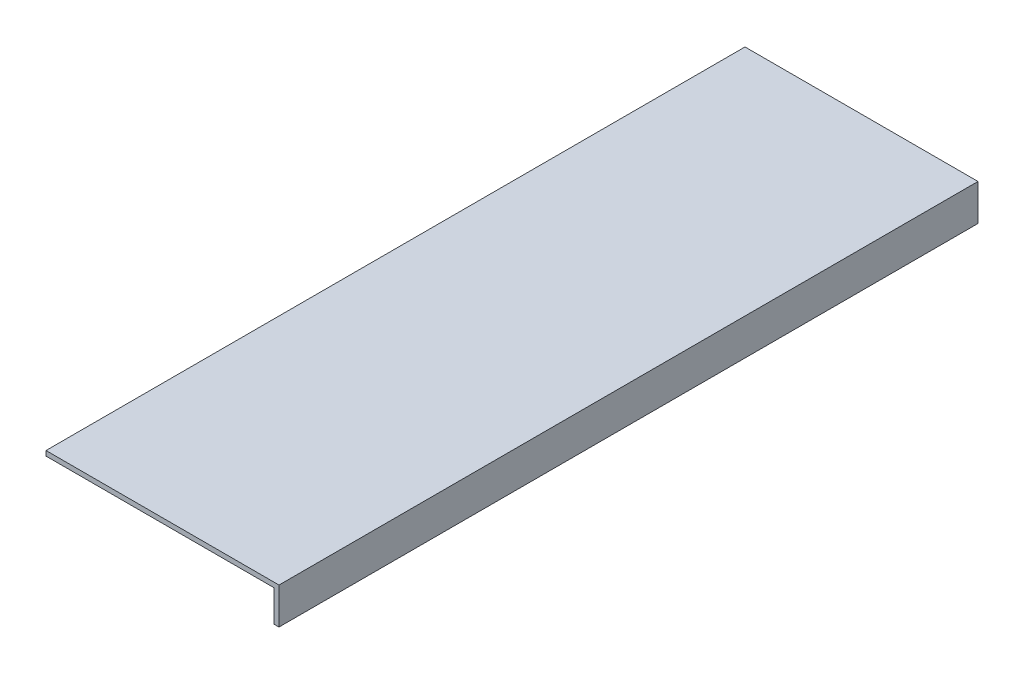
ISO-10303-21;
HEADER;
FILE_DESCRIPTION(('STEP AP214'),'2;1');
FILE_NAME('part.step','',(''),(''),'','','');
FILE_SCHEMA(('AUTOMOTIVE_DESIGN { 1 0 10303 214 1 1 1 1 }'));
ENDSEC;
DATA;
#1=APPLICATION_CONTEXT('core data for automotive mechanical design processes');
#2=APPLICATION_PROTOCOL_DEFINITION('international standard','automotive_design',2000,#1);
#3=PRODUCT_CONTEXT('',#1,'mechanical');
#4=PRODUCT('Part','Part','',(#3));
#5=PRODUCT_RELATED_PRODUCT_CATEGORY('part','',(#4));
#6=PRODUCT_DEFINITION_FORMATION('','',#4);
#7=PRODUCT_DEFINITION_CONTEXT('part definition',#1,'design');
#8=PRODUCT_DEFINITION('design','',#6,#7);
#9=PRODUCT_DEFINITION_SHAPE('','',#8);
#10=(LENGTH_UNIT() NAMED_UNIT(*) SI_UNIT(.MILLI.,.METRE.));
#11=(NAMED_UNIT(*) PLANE_ANGLE_UNIT() SI_UNIT($,.RADIAN.));
#12=(NAMED_UNIT(*) SI_UNIT($,.STERADIAN.) SOLID_ANGLE_UNIT());
#13=UNCERTAINTY_MEASURE_WITH_UNIT(LENGTH_MEASURE(1.E-05),#10,'distance_accuracy_value','');
#14=(GEOMETRIC_REPRESENTATION_CONTEXT(3) GLOBAL_UNCERTAINTY_ASSIGNED_CONTEXT((#13)) GLOBAL_UNIT_ASSIGNED_CONTEXT((#10,
#11,#12)) REPRESENTATION_CONTEXT('',''));
#15=CARTESIAN_POINT('',(0.,0.,0.));
#16=DIRECTION('',(0.,0.,1.));
#17=DIRECTION('',(1.,0.,0.));
#18=AXIS2_PLACEMENT_3D('',#15,#16,#17);
#19=CARTESIAN_POINT('',(0.,3.175,0.));
#20=DIRECTION('',(1.,0.,0.));
#21=DIRECTION('',(0.,0.,-1.));
#22=AXIS2_PLACEMENT_3D('',#19,#20,#21);
#23=PLANE('',#22);
#24=DIRECTION('',(0.,0.,1.));
#25=VECTOR('',#24,1.);
#26=CARTESIAN_POINT('',(0.,0.,0.));
#27=LINE('',#26,#25);
#28=CARTESIAN_POINT('',(0.,0.,-457.2));
#29=VERTEX_POINT('',#28);
#30=CARTESIAN_POINT('',(0.,0.,0.));
#31=VERTEX_POINT('',#30);
#32=EDGE_CURVE('E117',#29,#31,#27,.T.);
#33=ORIENTED_EDGE('',*,*,#32,.T.);
#34=DIRECTION('',(0.,-1.,0.));
#35=VECTOR('',#34,1.);
#36=CARTESIAN_POINT('',(0.,3.175,0.));
#37=LINE('',#36,#35);
#38=CARTESIAN_POINT('',(0.,3.175,0.));
#39=VERTEX_POINT('',#38);
#40=EDGE_CURVE('E39',#39,#31,#37,.T.);
#41=ORIENTED_EDGE('',*,*,#40,.F.);
#42=DIRECTION('',(0.,0.,1.));
#43=VECTOR('',#42,1.);
#44=CARTESIAN_POINT('',(0.,3.175,0.));
#45=LINE('',#44,#43);
#46=CARTESIAN_POINT('',(0.,3.175,-457.2));
#47=VERTEX_POINT('',#46);
#48=EDGE_CURVE('E119',#47,#39,#45,.T.);
#49=ORIENTED_EDGE('',*,*,#48,.F.);
#50=DIRECTION('',(0.,-1.,0.));
#51=VECTOR('',#50,1.);
#52=CARTESIAN_POINT('',(0.,3.175,-457.2));
#53=LINE('',#52,#51);
#54=EDGE_CURVE('E97',#47,#29,#53,.T.);
#55=ORIENTED_EDGE('',*,*,#54,.T.);
#56=EDGE_LOOP('',(#33,#41,#49,#55));
#57=FACE_BOUND('',#56,.T.);
#58=ADVANCED_FACE('F32',(#57),#23,.F.);
#59=CARTESIAN_POINT('',(0.,3.175,0.));
#60=DIRECTION('',(0.,0.,-1.));
#61=DIRECTION('',(-1.,0.,0.));
#62=AXIS2_PLACEMENT_3D('',#59,#60,#61);
#63=PLANE('',#62);
#64=DIRECTION('',(1.,0.,0.));
#65=VECTOR('',#64,1.);
#66=CARTESIAN_POINT('',(0.,0.,0.));
#67=LINE('',#66,#65);
#68=CARTESIAN_POINT('',(149.225,0.,0.));
#69=VERTEX_POINT('',#68);
#70=EDGE_CURVE('E127',#31,#69,#67,.T.);
#71=ORIENTED_EDGE('',*,*,#70,.T.);
#72=DIRECTION('',(0.,1.,0.));
#73=VECTOR('',#72,1.);
#74=CARTESIAN_POINT('',(149.225,-20.6375,0.));
#75=LINE('',#74,#73);
#76=CARTESIAN_POINT('',(149.225,-20.6375,0.));
#77=VERTEX_POINT('',#76);
#78=EDGE_CURVE('E115',#77,#69,#75,.T.);
#79=ORIENTED_EDGE('',*,*,#78,.F.);
#80=DIRECTION('',(1.,0.,0.));
#81=VECTOR('',#80,1.);
#82=CARTESIAN_POINT('',(152.4,-20.6375,0.));
#83=LINE('',#82,#81);
#84=CARTESIAN_POINT('',(152.4,-20.6375,0.));
#85=VERTEX_POINT('',#84);
#86=EDGE_CURVE('E113',#77,#85,#83,.T.);
#87=ORIENTED_EDGE('',*,*,#86,.T.);
#88=DIRECTION('',(0.,-1.,0.));
#89=VECTOR('',#88,1.);
#90=CARTESIAN_POINT('',(152.4,3.175,0.));
#91=LINE('',#90,#89);
#92=CARTESIAN_POINT('',(152.4,3.175,0.));
#93=VERTEX_POINT('',#92);
#94=EDGE_CURVE('E96',#93,#85,#91,.T.);
#95=ORIENTED_EDGE('',*,*,#94,.F.);
#96=DIRECTION('',(1.,0.,0.));
#97=VECTOR('',#96,1.);
#98=CARTESIAN_POINT('',(0.,3.175,0.));
#99=LINE('',#98,#97);
#100=EDGE_CURVE('E74',#39,#93,#99,.T.);
#101=ORIENTED_EDGE('',*,*,#100,.F.);
#102=ORIENTED_EDGE('',*,*,#40,.T.);
#103=EDGE_LOOP('',(#71,#79,#87,#95,#101,#102));
#104=FACE_BOUND('',#103,.T.);
#105=ADVANCED_FACE('F133',(#104),#63,.F.);
#106=CARTESIAN_POINT('',(152.4,3.175,0.));
#107=DIRECTION('',(-1.,0.,0.));
#108=DIRECTION('',(0.,0.,1.));
#109=AXIS2_PLACEMENT_3D('',#106,#107,#108);
#110=PLANE('',#109);
#111=ORIENTED_EDGE('',*,*,#94,.T.);
#112=DIRECTION('',(0.,0.,-1.));
#113=VECTOR('',#112,1.);
#114=CARTESIAN_POINT('',(152.4,-20.6375,-457.2));
#115=LINE('',#114,#113);
#116=CARTESIAN_POINT('',(152.4,-20.6375,-457.2));
#117=VERTEX_POINT('',#116);
#118=EDGE_CURVE('E104',#85,#117,#115,.T.);
#119=ORIENTED_EDGE('',*,*,#118,.T.);
#120=DIRECTION('',(0.,-1.,0.));
#121=VECTOR('',#120,1.);
#122=CARTESIAN_POINT('',(152.4,3.175,-457.2));
#123=LINE('',#122,#121);
#124=CARTESIAN_POINT('',(152.4,3.175,-457.2));
#125=VERTEX_POINT('',#124);
#126=EDGE_CURVE('E89',#125,#117,#123,.T.);
#127=ORIENTED_EDGE('',*,*,#126,.F.);
#128=DIRECTION('',(0.,0.,-1.));
#129=VECTOR('',#128,1.);
#130=CARTESIAN_POINT('',(152.4,3.175,0.));
#131=LINE('',#130,#129);
#132=EDGE_CURVE('E122',#93,#125,#131,.T.);
#133=ORIENTED_EDGE('',*,*,#132,.F.);
#134=EDGE_LOOP('',(#111,#119,#127,#133));
#135=FACE_BOUND('',#134,.T.);
#136=ADVANCED_FACE('F109',(#135),#110,.F.);
#137=CARTESIAN_POINT('',(0.,3.175,-457.2));
#138=DIRECTION('',(0.,0.,1.));
#139=DIRECTION('',(1.,0.,0.));
#140=AXIS2_PLACEMENT_3D('',#137,#138,#139);
#141=PLANE('',#140);
#142=ORIENTED_EDGE('',*,*,#54,.F.);
#143=DIRECTION('',(-1.,0.,0.));
#144=VECTOR('',#143,1.);
#145=CARTESIAN_POINT('',(0.,3.175,-457.2));
#146=LINE('',#145,#144);
#147=EDGE_CURVE('E54',#125,#47,#146,.T.);
#148=ORIENTED_EDGE('',*,*,#147,.F.);
#149=ORIENTED_EDGE('',*,*,#126,.T.);
#150=DIRECTION('',(-1.,0.,0.));
#151=VECTOR('',#150,1.);
#152=CARTESIAN_POINT('',(152.4,-20.6375,-457.2));
#153=LINE('',#152,#151);
#154=CARTESIAN_POINT('',(149.225,-20.6375,-457.2));
#155=VERTEX_POINT('',#154);
#156=EDGE_CURVE('E92',#117,#155,#153,.T.);
#157=ORIENTED_EDGE('',*,*,#156,.T.);
#158=DIRECTION('',(0.,1.,0.));
#159=VECTOR('',#158,1.);
#160=CARTESIAN_POINT('',(149.225,-20.6375,-457.2));
#161=LINE('',#160,#159);
#162=CARTESIAN_POINT('',(149.225,0.,-457.2));
#163=VERTEX_POINT('',#162);
#164=EDGE_CURVE('E46',#155,#163,#161,.T.);
#165=ORIENTED_EDGE('',*,*,#164,.T.);
#166=DIRECTION('',(-1.,0.,0.));
#167=VECTOR('',#166,1.);
#168=CARTESIAN_POINT('',(0.,0.,-457.2));
#169=LINE('',#168,#167);
#170=EDGE_CURVE('E66',#163,#29,#169,.T.);
#171=ORIENTED_EDGE('',*,*,#170,.T.);
#172=EDGE_LOOP('',(#142,#148,#149,#157,#165,#171));
#173=FACE_BOUND('',#172,.T.);
#174=ADVANCED_FACE('F91',(#173),#141,.F.);
#175=CARTESIAN_POINT('',(0.,3.175,0.));
#176=DIRECTION('',(0.,-1.,0.));
#177=DIRECTION('',(0.,0.,-1.));
#178=AXIS2_PLACEMENT_3D('',#175,#176,#177);
#179=PLANE('',#178);
#180=ORIENTED_EDGE('',*,*,#100,.T.);
#181=ORIENTED_EDGE('',*,*,#132,.T.);
#182=ORIENTED_EDGE('',*,*,#147,.T.);
#183=ORIENTED_EDGE('',*,*,#48,.T.);
#184=EDGE_LOOP('',(#180,#181,#182,#183));
#185=FACE_BOUND('',#184,.T.);
#186=ADVANCED_FACE('F142',(#185),#179,.F.);
#187=CARTESIAN_POINT('',(0.,0.,0.));
#188=DIRECTION('',(0.,-1.,0.));
#189=DIRECTION('',(0.,0.,-1.));
#190=AXIS2_PLACEMENT_3D('',#187,#188,#189);
#191=PLANE('',#190);
#192=DIRECTION('',(0.,0.,-1.));
#193=VECTOR('',#192,1.);
#194=CARTESIAN_POINT('',(149.225,0.,0.));
#195=LINE('',#194,#193);
#196=EDGE_CURVE('E11',#69,#163,#195,.T.);
#197=ORIENTED_EDGE('',*,*,#196,.F.);
#198=ORIENTED_EDGE('',*,*,#70,.F.);
#199=ORIENTED_EDGE('',*,*,#32,.F.);
#200=ORIENTED_EDGE('',*,*,#170,.F.);
#201=EDGE_LOOP('',(#197,#198,#199,#200));
#202=FACE_BOUND('',#201,.T.);
#203=ADVANCED_FACE('F139',(#202),#191,.T.);
#204=CARTESIAN_POINT('',(149.225,-20.6375,-457.2));
#205=DIRECTION('',(-1.,0.,0.));
#206=DIRECTION('',(0.,0.,1.));
#207=AXIS2_PLACEMENT_3D('',#204,#205,#206);
#208=PLANE('',#207);
#209=ORIENTED_EDGE('',*,*,#78,.T.);
#210=ORIENTED_EDGE('',*,*,#196,.T.);
#211=ORIENTED_EDGE('',*,*,#164,.F.);
#212=DIRECTION('',(0.,0.,1.));
#213=VECTOR('',#212,1.);
#214=CARTESIAN_POINT('',(149.225,-20.6375,-457.2));
#215=LINE('',#214,#213);
#216=EDGE_CURVE('E107',#155,#77,#215,.T.);
#217=ORIENTED_EDGE('',*,*,#216,.T.);
#218=EDGE_LOOP('',(#209,#210,#211,#217));
#219=FACE_BOUND('',#218,.T.);
#220=ADVANCED_FACE('F141',(#219),#208,.T.);
#221=CARTESIAN_POINT('',(0.,-20.6375,0.));
#222=DIRECTION('',(0.,-1.,0.));
#223=DIRECTION('',(0.,0.,-1.));
#224=AXIS2_PLACEMENT_3D('',#221,#222,#223);
#225=PLANE('',#224);
#226=ORIENTED_EDGE('',*,*,#118,.F.);
#227=ORIENTED_EDGE('',*,*,#86,.F.);
#228=ORIENTED_EDGE('',*,*,#216,.F.);
#229=ORIENTED_EDGE('',*,*,#156,.F.);
#230=EDGE_LOOP('',(#226,#227,#228,#229));
#231=FACE_BOUND('',#230,.T.);
#232=ADVANCED_FACE('F102',(#231),#225,.T.);
#233=CLOSED_SHELL('',(#58,#105,#136,#174,#186,#203,#220,#232));
#234=MANIFOLD_SOLID_BREP('B2',#233);
#235=ADVANCED_BREP_SHAPE_REPRESENTATION('',(#18,#234),#14);
#236=SHAPE_DEFINITION_REPRESENTATION(#9,#235);
ENDSEC;
END-ISO-10303-21;
